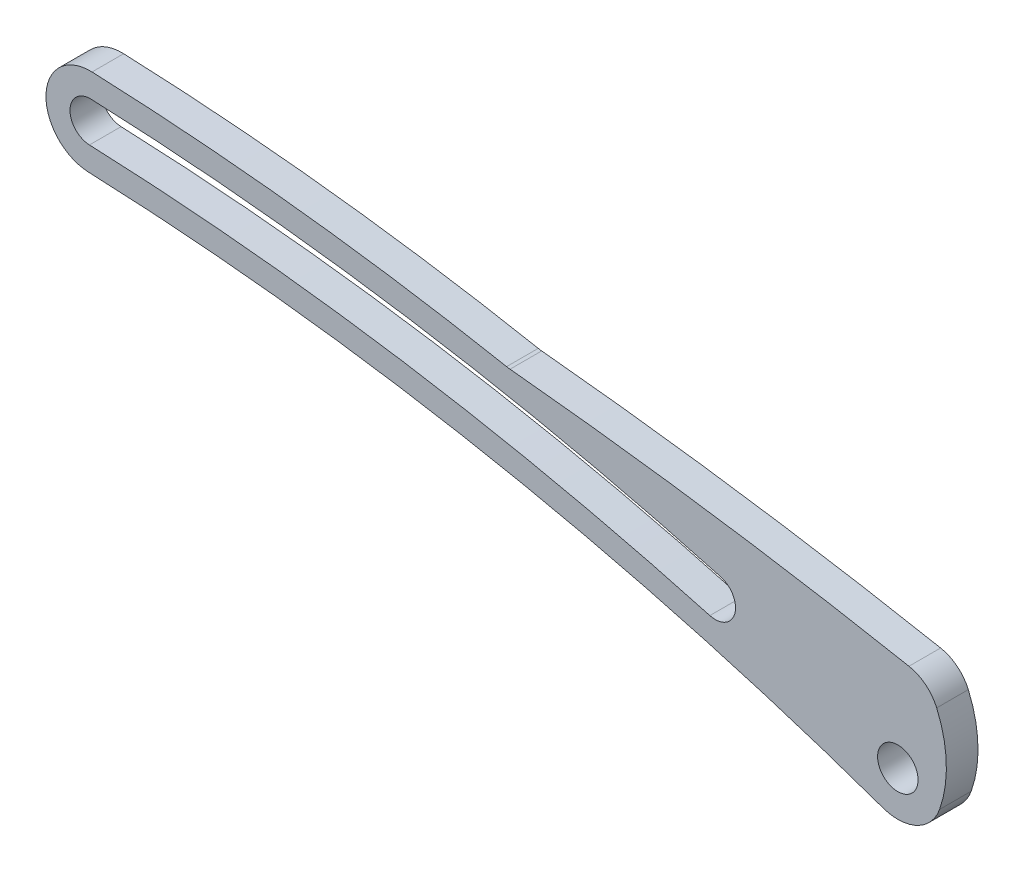
ISO-10303-21;
HEADER;
FILE_DESCRIPTION(('STEP AP214'),'2;1');
FILE_NAME('part.step','',(''),(''),'','','');
FILE_SCHEMA(('AUTOMOTIVE_DESIGN { 1 0 10303 214 1 1 1 1 }'));
ENDSEC;
DATA;
#1=APPLICATION_CONTEXT('core data for automotive mechanical design processes');
#2=APPLICATION_PROTOCOL_DEFINITION('international standard','automotive_design',2000,#1);
#3=PRODUCT_CONTEXT('',#1,'mechanical');
#4=PRODUCT('Part','Part','',(#3));
#5=PRODUCT_RELATED_PRODUCT_CATEGORY('part','',(#4));
#6=PRODUCT_DEFINITION_FORMATION('','',#4);
#7=PRODUCT_DEFINITION_CONTEXT('part definition',#1,'design');
#8=PRODUCT_DEFINITION('design','',#6,#7);
#9=PRODUCT_DEFINITION_SHAPE('','',#8);
#10=(LENGTH_UNIT() NAMED_UNIT(*) SI_UNIT(.MILLI.,.METRE.));
#11=(NAMED_UNIT(*) PLANE_ANGLE_UNIT() SI_UNIT($,.RADIAN.));
#12=(NAMED_UNIT(*) SI_UNIT($,.STERADIAN.) SOLID_ANGLE_UNIT());
#13=UNCERTAINTY_MEASURE_WITH_UNIT(LENGTH_MEASURE(1.E-05),#10,'distance_accuracy_value','');
#14=(GEOMETRIC_REPRESENTATION_CONTEXT(3) GLOBAL_UNCERTAINTY_ASSIGNED_CONTEXT((#13)) GLOBAL_UNIT_ASSIGNED_CONTEXT((#10,
#11,#12)) REPRESENTATION_CONTEXT('',''));
#15=CARTESIAN_POINT('',(0.,0.,0.));
#16=DIRECTION('',(0.,0.,1.));
#17=DIRECTION('',(1.,0.,0.));
#18=AXIS2_PLACEMENT_3D('',#15,#16,#17);
#19=CARTESIAN_POINT('',(-22.5000187521249,-6.99999999999998,2.5));
#20=DIRECTION('',(0.,0.,-1.));
#21=DIRECTION('',(-1.,0.,0.));
#22=AXIS2_PLACEMENT_3D('',#19,#20,#21);
#23=CYLINDRICAL_SURFACE('',#22,3.5);
#24=DIRECTION('',(0.,0.,-1.));
#25=VECTOR('',#24,1.);
#26=CARTESIAN_POINT('',(-19.2019250944073,-8.17157083649374,2.5));
#27=LINE('',#26,#25);
#28=CARTESIAN_POINT('',(-19.2019250944073,-8.17157083649374,2.5));
#29=VERTEX_POINT('',#28);
#30=CARTESIAN_POINT('',(-19.2019250944073,-8.17157083649374,0.));
#31=VERTEX_POINT('',#30);
#32=EDGE_CURVE('E237',#29,#31,#27,.T.);
#33=ORIENTED_EDGE('',*,*,#32,.F.);
#34=CARTESIAN_POINT('',(-22.5000187521249,-6.99999999999998,2.5));
#35=DIRECTION('',(0.,0.,1.));
#36=DIRECTION('',(1.,0.,0.));
#37=AXIS2_PLACEMENT_3D('',#34,#35,#36);
#38=CIRCLE('',#37,3.5);
#39=CARTESIAN_POINT('',(-23.6715895886187,-10.2980936577176,2.5));
#40=VERTEX_POINT('',#39);
#41=EDGE_CURVE('E219',#40,#29,#38,.T.);
#42=ORIENTED_EDGE('',*,*,#41,.F.);
#43=DIRECTION('',(0.,0.,-1.));
#44=VECTOR('',#43,1.);
#45=CARTESIAN_POINT('',(-23.6715895886187,-10.2980936577176,2.5));
#46=LINE('',#45,#44);
#47=CARTESIAN_POINT('',(-23.6715895886187,-10.2980936577176,0.));
#48=VERTEX_POINT('',#47);
#49=EDGE_CURVE('E158',#40,#48,#46,.T.);
#50=ORIENTED_EDGE('',*,*,#49,.T.);
#51=CARTESIAN_POINT('',(-22.5000187521249,-6.99999999999998,0.));
#52=DIRECTION('',(0.,0.,1.));
#53=DIRECTION('',(1.,0.,0.));
#54=AXIS2_PLACEMENT_3D('',#51,#52,#53);
#55=CIRCLE('',#54,3.5);
#56=EDGE_CURVE('E251',#48,#31,#55,.T.);
#57=ORIENTED_EDGE('',*,*,#56,.T.);
#58=EDGE_LOOP('',(#33,#42,#50,#57));
#59=FACE_BOUND('',#58,.T.);
#60=ADVANCED_FACE('F41',(#59),#23,.T.);
#61=CARTESIAN_POINT('',(-94.9700433523818,-211.010650541677,2.5));
#62=DIRECTION('',(0.,0.,-1.));
#63=DIRECTION('',(-1.,0.,0.));
#64=AXIS2_PLACEMENT_3D('',#61,#62,#63);
#65=CYLINDRICAL_SURFACE('',#64,220.);
#66=CARTESIAN_POINT('',(-94.9700433523818,-211.010650541677,2.5));
#67=DIRECTION('',(0.,0.,1.));
#68=DIRECTION('',(1.,0.,0.));
#69=AXIS2_PLACEMENT_3D('',#66,#67,#68);
#70=CIRCLE('',#69,220.);
#71=CARTESIAN_POINT('',(-53.4181436678845,5.02971520650811,2.5));
#72=VERTEX_POINT('',#71);
#73=CARTESIAN_POINT('',(-86.1826443651931,8.81378308443306,2.5));
#74=VERTEX_POINT('',#73);
#75=EDGE_CURVE('E210',#72,#74,#70,.T.);
#76=ORIENTED_EDGE('',*,*,#75,.F.);
#77=DIRECTION('',(0.,0.,-1.));
#78=VECTOR('',#77,1.);
#79=CARTESIAN_POINT('',(-53.4181436678845,5.02971520650811,2.5));
#80=LINE('',#79,#78);
#81=CARTESIAN_POINT('',(-53.4181436678845,5.02971520650811,0.));
#82=VERTEX_POINT('',#81);
#83=EDGE_CURVE('E168',#72,#82,#80,.T.);
#84=ORIENTED_EDGE('',*,*,#83,.T.);
#85=CARTESIAN_POINT('',(-94.9700433523818,-211.010650541677,0.));
#86=DIRECTION('',(0.,0.,1.));
#87=DIRECTION('',(1.,0.,0.));
#88=AXIS2_PLACEMENT_3D('',#85,#86,#87);
#89=CIRCLE('',#88,220.);
#90=CARTESIAN_POINT('',(-86.1826443651931,8.81378308443306,0.));
#91=VERTEX_POINT('',#90);
#92=EDGE_CURVE('E193',#82,#91,#89,.T.);
#93=ORIENTED_EDGE('',*,*,#92,.T.);
#94=DIRECTION('',(0.,0.,-1.));
#95=VECTOR('',#94,1.);
#96=CARTESIAN_POINT('',(-86.1826443651931,8.81378308443306,2.5));
#97=LINE('',#96,#95);
#98=EDGE_CURVE('E173',#74,#91,#97,.T.);
#99=ORIENTED_EDGE('',*,*,#98,.F.);
#100=EDGE_LOOP('',(#76,#84,#93,#99));
#101=FACE_BOUND('',#100,.T.);
#102=ADVANCED_FACE('F214',(#101),#65,.T.);
#103=CARTESIAN_POINT('',(-86.3224438945347,5.31657618583584,2.5));
#104=DIRECTION('',(0.,0.,-1.));
#105=DIRECTION('',(-1.,0.,0.));
#106=AXIS2_PLACEMENT_3D('',#103,#104,#105);
#107=CYLINDRICAL_SURFACE('',#106,3.5);
#108=CARTESIAN_POINT('',(-86.3224438945347,5.31657618583584,0.));
#109=DIRECTION('',(0.,0.,1.));
#110=DIRECTION('',(1.,0.,0.));
#111=AXIS2_PLACEMENT_3D('',#108,#109,#110);
#112=CIRCLE('',#111,3.5);
#113=CARTESIAN_POINT('',(-86.4622434238763,1.81936928723866,0.));
#114=VERTEX_POINT('',#113);
#115=EDGE_CURVE('E257',#91,#114,#112,.T.);
#116=ORIENTED_EDGE('',*,*,#115,.T.);
#117=DIRECTION('',(0.,0.,-1.));
#118=VECTOR('',#117,1.);
#119=CARTESIAN_POINT('',(-86.4622434238763,1.81936928723866,2.5));
#120=LINE('',#119,#118);
#121=CARTESIAN_POINT('',(-86.4622434238763,1.81936928723866,2.5));
#122=VERTEX_POINT('',#121);
#123=EDGE_CURVE('E162',#122,#114,#120,.T.);
#124=ORIENTED_EDGE('',*,*,#123,.F.);
#125=CARTESIAN_POINT('',(-86.3224438945347,5.31657618583584,2.5));
#126=DIRECTION('',(0.,0.,1.));
#127=DIRECTION('',(1.,0.,0.));
#128=AXIS2_PLACEMENT_3D('',#125,#126,#127);
#129=CIRCLE('',#128,3.5);
#130=EDGE_CURVE('E218',#74,#122,#129,.T.);
#131=ORIENTED_EDGE('',*,*,#130,.F.);
#132=ORIENTED_EDGE('',*,*,#98,.T.);
#133=EDGE_LOOP('',(#116,#124,#131,#132));
#134=FACE_BOUND('',#133,.T.);
#135=ADVANCED_FACE('F295',(#134),#107,.T.);
#136=CARTESIAN_POINT('',(-94.9700433523818,-211.010650541677,2.5));
#137=DIRECTION('',(0.,0.,-1.));
#138=DIRECTION('',(-1.,0.,0.));
#139=AXIS2_PLACEMENT_3D('',#136,#137,#138);
#140=CYLINDRICAL_SURFACE('',#139,218.1);
#141=CARTESIAN_POINT('',(-94.9700433523818,-211.010650541677,0.));
#142=DIRECTION('',(0.,0.,1.));
#143=DIRECTION('',(1.,0.,0.));
#144=AXIS2_PLACEMENT_3D('',#141,#142,#143);
#145=CIRCLE('',#144,218.1);
#146=CARTESIAN_POINT('',(-86.2585355382643,6.91529933948025,0.));
#147=VERTEX_POINT('',#146);
#148=CARTESIAN_POINT('',(-36.4982119210194,-0.894837407437954,0.));
#149=VERTEX_POINT('',#148);
#150=EDGE_CURVE('E156',#147,#149,#145,.F.);
#151=ORIENTED_EDGE('',*,*,#150,.T.);
#152=DIRECTION('',(0.,0.,-1.));
#153=VECTOR('',#152,1.);
#154=CARTESIAN_POINT('',(-36.4982119210194,-0.894837407437954,2.5));
#155=LINE('',#154,#153);
#156=CARTESIAN_POINT('',(-36.4982119210194,-0.894837407437954,2.5));
#157=VERTEX_POINT('',#156);
#158=EDGE_CURVE('E135',#157,#149,#155,.T.);
#159=ORIENTED_EDGE('',*,*,#158,.F.);
#160=CARTESIAN_POINT('',(-94.9700433523818,-211.010650541677,2.5));
#161=DIRECTION('',(0.,0.,1.));
#162=DIRECTION('',(1.,0.,0.));
#163=AXIS2_PLACEMENT_3D('',#160,#161,#162);
#164=CIRCLE('',#163,218.1);
#165=CARTESIAN_POINT('',(-86.2585355382643,6.91529933948025,2.5));
#166=VERTEX_POINT('',#165);
#167=EDGE_CURVE('E143',#166,#157,#164,.F.);
#168=ORIENTED_EDGE('',*,*,#167,.F.);
#169=DIRECTION('',(0.,0.,-1.));
#170=VECTOR('',#169,1.);
#171=CARTESIAN_POINT('',(-86.2585355382643,6.91529933948025,2.5));
#172=LINE('',#171,#170);
#173=EDGE_CURVE('E232',#166,#147,#172,.T.);
#174=ORIENTED_EDGE('',*,*,#173,.T.);
#175=EDGE_LOOP('',(#151,#159,#168,#174));
#176=FACE_BOUND('',#175,.T.);
#177=ADVANCED_FACE('F154',(#176),#140,.F.);
#178=CARTESIAN_POINT('',(-36.9271662093742,-2.43626473900507,2.5));
#179=DIRECTION('',(0.,0.,-1.));
#180=DIRECTION('',(-1.,0.,0.));
#181=AXIS2_PLACEMENT_3D('',#178,#179,#180);
#182=CYLINDRICAL_SURFACE('',#181,1.59999999999999);
#183=CARTESIAN_POINT('',(-36.9271662093742,-2.43626473900507,0.));
#184=DIRECTION('',(0.,0.,1.));
#185=DIRECTION('',(1.,0.,0.));
#186=AXIS2_PLACEMENT_3D('',#183,#184,#185);
#187=CIRCLE('',#186,1.59999999999999);
#188=CARTESIAN_POINT('',(-37.356120497729,-3.97769207057212,0.));
#189=VERTEX_POINT('',#188);
#190=EDGE_CURVE('E240',#149,#189,#187,.F.);
#191=ORIENTED_EDGE('',*,*,#190,.T.);
#192=DIRECTION('',(0.,0.,-1.));
#193=VECTOR('',#192,1.);
#194=CARTESIAN_POINT('',(-37.356120497729,-3.97769207057212,2.5));
#195=LINE('',#194,#193);
#196=CARTESIAN_POINT('',(-37.356120497729,-3.97769207057212,2.5));
#197=VERTEX_POINT('',#196);
#198=EDGE_CURVE('E137',#197,#189,#195,.T.);
#199=ORIENTED_EDGE('',*,*,#198,.F.);
#200=CARTESIAN_POINT('',(-36.9271662093742,-2.43626473900507,2.5));
#201=DIRECTION('',(0.,0.,1.));
#202=DIRECTION('',(1.,0.,0.));
#203=AXIS2_PLACEMENT_3D('',#200,#201,#202);
#204=CIRCLE('',#203,1.59999999999999);
#205=EDGE_CURVE('E130',#157,#197,#204,.F.);
#206=ORIENTED_EDGE('',*,*,#205,.F.);
#207=ORIENTED_EDGE('',*,*,#158,.T.);
#208=EDGE_LOOP('',(#191,#199,#206,#207));
#209=FACE_BOUND('',#208,.T.);
#210=ADVANCED_FACE('F133',(#209),#182,.F.);
#211=CARTESIAN_POINT('',(-94.9700433523818,-211.010650541677,2.5));
#212=DIRECTION('',(0.,0.,-1.));
#213=DIRECTION('',(-1.,0.,0.));
#214=AXIS2_PLACEMENT_3D('',#211,#212,#213);
#215=CYLINDRICAL_SURFACE('',#214,214.9);
#216=CARTESIAN_POINT('',(-94.9700433523818,-211.010650541677,0.));
#217=DIRECTION('',(0.,0.,1.));
#218=DIRECTION('',(1.,0.,0.));
#219=AXIS2_PLACEMENT_3D('',#216,#217,#218);
#220=CIRCLE('',#219,214.9);
#221=CARTESIAN_POINT('',(-86.3863522508052,3.71785303219143,0.));
#222=VERTEX_POINT('',#221);
#223=EDGE_CURVE('E243',#222,#189,#220,.F.);
#224=ORIENTED_EDGE('',*,*,#223,.F.);
#225=DIRECTION('',(0.,0.,-1.));
#226=VECTOR('',#225,1.);
#227=CARTESIAN_POINT('',(-86.3863522508052,3.71785303219143,2.5));
#228=LINE('',#227,#226);
#229=CARTESIAN_POINT('',(-86.3863522508052,3.71785303219143,2.5));
#230=VERTEX_POINT('',#229);
#231=EDGE_CURVE('E164',#230,#222,#228,.T.);
#232=ORIENTED_EDGE('',*,*,#231,.F.);
#233=CARTESIAN_POINT('',(-94.9700433523818,-211.010650541677,2.5));
#234=DIRECTION('',(0.,0.,1.));
#235=DIRECTION('',(1.,0.,0.));
#236=AXIS2_PLACEMENT_3D('',#233,#234,#235);
#237=CIRCLE('',#236,214.9);
#238=EDGE_CURVE('E142',#230,#197,#237,.F.);
#239=ORIENTED_EDGE('',*,*,#238,.T.);
#240=ORIENTED_EDGE('',*,*,#198,.T.);
#241=EDGE_LOOP('',(#224,#232,#239,#240));
#242=FACE_BOUND('',#241,.T.);
#243=ADVANCED_FACE('F276',(#242),#215,.T.);
#244=CARTESIAN_POINT('',(-86.3224438945347,5.31657618583584,2.5));
#245=DIRECTION('',(0.,0.,-1.));
#246=DIRECTION('',(-1.,0.,0.));
#247=AXIS2_PLACEMENT_3D('',#244,#245,#246);
#248=CYLINDRICAL_SURFACE('',#247,1.59999999999998);
#249=CARTESIAN_POINT('',(-86.3224438945347,5.31657618583584,0.));
#250=DIRECTION('',(0.,0.,1.));
#251=DIRECTION('',(1.,0.,0.));
#252=AXIS2_PLACEMENT_3D('',#249,#250,#251);
#253=CIRCLE('',#252,1.59999999999998);
#254=EDGE_CURVE('E247',#147,#222,#253,.T.);
#255=ORIENTED_EDGE('',*,*,#254,.F.);
#256=ORIENTED_EDGE('',*,*,#173,.F.);
#257=CARTESIAN_POINT('',(-86.3224438945347,5.31657618583584,2.5));
#258=DIRECTION('',(0.,0.,1.));
#259=DIRECTION('',(1.,0.,0.));
#260=AXIS2_PLACEMENT_3D('',#257,#258,#259);
#261=CIRCLE('',#260,1.59999999999998);
#262=EDGE_CURVE('E149',#166,#230,#261,.T.);
#263=ORIENTED_EDGE('',*,*,#262,.T.);
#264=ORIENTED_EDGE('',*,*,#231,.T.);
#265=EDGE_LOOP('',(#255,#256,#263,#264));
#266=FACE_BOUND('',#265,.T.);
#267=ADVANCED_FACE('F274',(#266),#248,.F.);
#268=CARTESIAN_POINT('',(-22.5000187521249,-6.99999999999998,2.5));
#269=DIRECTION('',(0.,0.,-1.));
#270=DIRECTION('',(-1.,0.,0.));
#271=AXIS2_PLACEMENT_3D('',#268,#269,#270);
#272=CYLINDRICAL_SURFACE('',#271,1.6);
#273=CARTESIAN_POINT('',(-22.5000187521249,-6.99999999999998,2.5));
#274=DIRECTION('',(0.,0.,1.));
#275=DIRECTION('',(1.,0.,0.));
#276=AXIS2_PLACEMENT_3D('',#273,#274,#275);
#277=CIRCLE('',#276,1.6);
#278=CARTESIAN_POINT('',(-20.9000187521249,-6.99999999999998,2.5));
#279=VERTEX_POINT('',#278);
#280=EDGE_CURVE('E152',#279,#279,#277,.T.);
#281=ORIENTED_EDGE('',*,*,#280,.T.);
#282=EDGE_LOOP('',(#281));
#283=FACE_BOUND('',#282,.T.);
#284=CARTESIAN_POINT('',(-22.5000187521249,-6.99999999999998,0.));
#285=DIRECTION('',(0.,0.,1.));
#286=DIRECTION('',(1.,0.,0.));
#287=AXIS2_PLACEMENT_3D('',#284,#285,#286);
#288=CIRCLE('',#287,1.6);
#289=CARTESIAN_POINT('',(-20.9000187521249,-6.99999999999998,0.));
#290=VERTEX_POINT('',#289);
#291=EDGE_CURVE('E233',#290,#290,#288,.T.);
#292=ORIENTED_EDGE('',*,*,#291,.F.);
#293=EDGE_LOOP('',(#292));
#294=FACE_BOUND('',#293,.T.);
#295=ADVANCED_FACE('F302',(#283,#294),#272,.F.);
#296=CARTESIAN_POINT('',(-94.9700433523818,-211.010650541677,2.5));
#297=DIRECTION('',(0.,0.,-1.));
#298=DIRECTION('',(-1.,0.,0.));
#299=AXIS2_PLACEMENT_3D('',#296,#297,#298);
#300=CYLINDRICAL_SURFACE('',#299,213.);
#301=CARTESIAN_POINT('',(-94.9700433523818,-211.010650541677,0.));
#302=DIRECTION('',(0.,0.,1.));
#303=DIRECTION('',(1.,0.,0.));
#304=AXIS2_PLACEMENT_3D('',#301,#302,#303);
#305=CIRCLE('',#304,213.);
#306=EDGE_CURVE('E261',#48,#114,#305,.T.);
#307=ORIENTED_EDGE('',*,*,#306,.F.);
#308=ORIENTED_EDGE('',*,*,#49,.F.);
#309=CARTESIAN_POINT('',(-94.9700433523818,-211.010650541677,2.5));
#310=DIRECTION('',(0.,0.,1.));
#311=DIRECTION('',(1.,0.,0.));
#312=AXIS2_PLACEMENT_3D('',#309,#310,#311);
#313=CIRCLE('',#312,213.);
#314=EDGE_CURVE('E223',#40,#122,#313,.T.);
#315=ORIENTED_EDGE('',*,*,#314,.T.);
#316=ORIENTED_EDGE('',*,*,#123,.T.);
#317=EDGE_LOOP('',(#307,#308,#315,#316));
#318=FACE_BOUND('',#317,.T.);
#319=ADVANCED_FACE('F286',(#318),#300,.F.);
#320=CARTESIAN_POINT('',(0.,0.,2.5));
#321=DIRECTION('',(0.,0.,1.));
#322=DIRECTION('',(1.,0.,0.));
#323=AXIS2_PLACEMENT_3D('',#320,#321,#322);
#324=PLANE('',#323);
#325=CARTESIAN_POINT('',(-28.0125467228815,-5.04180303043184,2.5));
#326=DIRECTION('',(0.,0.,-1.));
#327=DIRECTION('',(-1.,0.,0.));
#328=AXIS2_PLACEMENT_3D('',#325,#326,#327);
#329=CIRCLE('',#328,9.35);
#330=CARTESIAN_POINT('',(-19.4296060192224,-1.33294486686297,2.5));
#331=VERTEX_POINT('',#330);
#332=EDGE_CURVE('E402',#331,#29,#329,.T.);
#333=ORIENTED_EDGE('',*,*,#332,.F.);
#334=CARTESIAN_POINT('',(-22.1834907369741,-2.52295283378351,2.5));
#335=DIRECTION('',(0.,0.,1.));
#336=DIRECTION('',(1.,0.,0.));
#337=AXIS2_PLACEMENT_3D('',#334,#335,#336);
#338=CIRCLE('',#337,3.);
#339=CARTESIAN_POINT('',(-21.618751058341,0.423412570469239,2.5));
#340=VERTEX_POINT('',#339);
#341=EDGE_CURVE('E184',#331,#340,#338,.T.);
#342=ORIENTED_EDGE('',*,*,#341,.T.);
#343=CARTESIAN_POINT('',(-87.5050468988714,-343.319217925683,2.5));
#344=DIRECTION('',(0.,0.,-1.));
#345=DIRECTION('',(-1.,0.,0.));
#346=AXIS2_PLACEMENT_3D('',#343,#344,#345);
#347=CIRCLE('',#346,350.);
#348=CARTESIAN_POINT('',(-53.1460326900803,4.99021080486434,2.5));
#349=VERTEX_POINT('',#348);
#350=EDGE_CURVE('E212',#349,#340,#347,.T.);
#351=ORIENTED_EDGE('',*,*,#350,.F.);
#352=CARTESIAN_POINT('',(-52.851526854005,7.97572019398332,2.5));
#353=DIRECTION('',(0.,0.,1.));
#354=DIRECTION('',(1.,0.,0.));
#355=AXIS2_PLACEMENT_3D('',#352,#353,#354);
#356=CIRCLE('',#355,3.);
#357=EDGE_CURVE('E11',#349,#72,#356,.F.);
#358=ORIENTED_EDGE('',*,*,#357,.T.);
#359=ORIENTED_EDGE('',*,*,#75,.T.);
#360=ORIENTED_EDGE('',*,*,#130,.T.);
#361=ORIENTED_EDGE('',*,*,#314,.F.);
#362=ORIENTED_EDGE('',*,*,#41,.T.);
#363=EDGE_LOOP('',(#333,#342,#351,#358,#359,#360,#361,#362));
#364=FACE_BOUND('',#363,.T.);
#365=ORIENTED_EDGE('',*,*,#280,.F.);
#366=EDGE_LOOP('',(#365));
#367=FACE_BOUND('',#366,.T.);
#368=ORIENTED_EDGE('',*,*,#167,.T.);
#369=ORIENTED_EDGE('',*,*,#205,.T.);
#370=ORIENTED_EDGE('',*,*,#238,.F.);
#371=ORIENTED_EDGE('',*,*,#262,.F.);
#372=EDGE_LOOP('',(#368,#369,#370,#371));
#373=FACE_BOUND('',#372,.T.);
#374=ADVANCED_FACE('F147',(#364,#367,#373),#324,.T.);
#375=CARTESIAN_POINT('',(0.,0.,0.));
#376=DIRECTION('',(0.,0.,1.));
#377=DIRECTION('',(1.,0.,0.));
#378=AXIS2_PLACEMENT_3D('',#375,#376,#377);
#379=PLANE('',#378);
#380=CARTESIAN_POINT('',(-87.5050468988714,-343.319217925683,0.));
#381=DIRECTION('',(0.,0.,-1.));
#382=DIRECTION('',(-1.,0.,0.));
#383=AXIS2_PLACEMENT_3D('',#380,#381,#382);
#384=CIRCLE('',#383,350.);
#385=CARTESIAN_POINT('',(-53.1460326900803,4.99021080486434,0.));
#386=VERTEX_POINT('',#385);
#387=CARTESIAN_POINT('',(-21.618751058341,0.423412570469239,0.));
#388=VERTEX_POINT('',#387);
#389=EDGE_CURVE('E191',#386,#388,#384,.T.);
#390=ORIENTED_EDGE('',*,*,#389,.T.);
#391=CARTESIAN_POINT('',(-22.1834907369741,-2.52295283378351,0.));
#392=DIRECTION('',(0.,0.,1.));
#393=DIRECTION('',(1.,0.,0.));
#394=AXIS2_PLACEMENT_3D('',#391,#392,#393);
#395=CIRCLE('',#394,3.);
#396=CARTESIAN_POINT('',(-19.4296060192224,-1.33294486686297,0.));
#397=VERTEX_POINT('',#396);
#398=EDGE_CURVE('E65',#388,#397,#395,.F.);
#399=ORIENTED_EDGE('',*,*,#398,.T.);
#400=CARTESIAN_POINT('',(-28.0125467228815,-5.04180303043184,0.));
#401=DIRECTION('',(0.,0.,-1.));
#402=DIRECTION('',(-1.,0.,0.));
#403=AXIS2_PLACEMENT_3D('',#400,#401,#402);
#404=CIRCLE('',#403,9.35);
#405=EDGE_CURVE('E203',#397,#31,#404,.T.);
#406=ORIENTED_EDGE('',*,*,#405,.T.);
#407=ORIENTED_EDGE('',*,*,#56,.F.);
#408=ORIENTED_EDGE('',*,*,#306,.T.);
#409=ORIENTED_EDGE('',*,*,#115,.F.);
#410=ORIENTED_EDGE('',*,*,#92,.F.);
#411=CARTESIAN_POINT('',(-52.851526854005,7.97572019398332,0.));
#412=DIRECTION('',(0.,0.,1.));
#413=DIRECTION('',(1.,0.,0.));
#414=AXIS2_PLACEMENT_3D('',#411,#412,#413);
#415=CIRCLE('',#414,3.);
#416=EDGE_CURVE('E50',#82,#386,#415,.T.);
#417=ORIENTED_EDGE('',*,*,#416,.T.);
#418=EDGE_LOOP('',(#390,#399,#406,#407,#408,#409,#410,#417));
#419=FACE_BOUND('',#418,.T.);
#420=ORIENTED_EDGE('',*,*,#291,.T.);
#421=EDGE_LOOP('',(#420));
#422=FACE_BOUND('',#421,.T.);
#423=ORIENTED_EDGE('',*,*,#150,.F.);
#424=ORIENTED_EDGE('',*,*,#254,.T.);
#425=ORIENTED_EDGE('',*,*,#223,.T.);
#426=ORIENTED_EDGE('',*,*,#190,.F.);
#427=EDGE_LOOP('',(#423,#424,#425,#426));
#428=FACE_BOUND('',#427,.T.);
#429=ADVANCED_FACE('F189',(#419,#422,#428),#379,.F.);
#430=CARTESIAN_POINT('',(-28.0125467228815,-5.04180303043184,2.5));
#431=DIRECTION('',(0.,0.,-1.));
#432=DIRECTION('',(-1.,0.,0.));
#433=AXIS2_PLACEMENT_3D('',#430,#431,#432);
#434=CYLINDRICAL_SURFACE('',#433,9.35);
#435=ORIENTED_EDGE('',*,*,#405,.F.);
#436=DIRECTION('',(0.,0.,-1.));
#437=VECTOR('',#436,1.);
#438=CARTESIAN_POINT('',(-19.4296060192224,-1.33294486686297,2.5));
#439=LINE('',#438,#437);
#440=EDGE_CURVE('E57',#397,#331,#439,.F.);
#441=ORIENTED_EDGE('',*,*,#440,.T.);
#442=ORIENTED_EDGE('',*,*,#332,.T.);
#443=ORIENTED_EDGE('',*,*,#32,.T.);
#444=EDGE_LOOP('',(#435,#441,#442,#443));
#445=FACE_BOUND('',#444,.T.);
#446=ADVANCED_FACE('F279',(#445),#434,.T.);
#447=CARTESIAN_POINT('',(-87.5050468988714,-343.319217925683,2.5));
#448=DIRECTION('',(0.,0.,-1.));
#449=DIRECTION('',(-1.,0.,0.));
#450=AXIS2_PLACEMENT_3D('',#447,#448,#449);
#451=CYLINDRICAL_SURFACE('',#450,350.);
#452=ORIENTED_EDGE('',*,*,#389,.F.);
#453=DIRECTION('',(0.,0.,-1.));
#454=VECTOR('',#453,1.);
#455=CARTESIAN_POINT('',(-53.1460326900803,4.99021080486439,2.5));
#456=LINE('',#455,#454);
#457=EDGE_CURVE('E177',#386,#349,#456,.F.);
#458=ORIENTED_EDGE('',*,*,#457,.T.);
#459=ORIENTED_EDGE('',*,*,#350,.T.);
#460=DIRECTION('',(0.,0.,-1.));
#461=VECTOR('',#460,1.);
#462=CARTESIAN_POINT('',(-21.618751058341,0.423412570469239,2.5));
#463=LINE('',#462,#461);
#464=EDGE_CURVE('E172',#340,#388,#463,.T.);
#465=ORIENTED_EDGE('',*,*,#464,.T.);
#466=EDGE_LOOP('',(#452,#458,#459,#465));
#467=FACE_BOUND('',#466,.T.);
#468=ADVANCED_FACE('F198',(#467),#451,.T.);
#469=CARTESIAN_POINT('',(-52.851526854005,7.97572019398332,2.5));
#470=DIRECTION('',(0.,0.,1.));
#471=DIRECTION('',(1.,0.,0.));
#472=AXIS2_PLACEMENT_3D('',#469,#470,#471);
#473=CYLINDRICAL_SURFACE('',#472,3.);
#474=ORIENTED_EDGE('',*,*,#357,.F.);
#475=ORIENTED_EDGE('',*,*,#457,.F.);
#476=ORIENTED_EDGE('',*,*,#416,.F.);
#477=ORIENTED_EDGE('',*,*,#83,.F.);
#478=EDGE_LOOP('',(#474,#475,#476,#477));
#479=FACE_BOUND('',#478,.T.);
#480=ADVANCED_FACE('F206',(#479),#473,.F.);
#481=CARTESIAN_POINT('',(-22.1834907369741,-2.52295283378351,2.5));
#482=DIRECTION('',(0.,0.,-1.));
#483=DIRECTION('',(-1.,0.,0.));
#484=AXIS2_PLACEMENT_3D('',#481,#482,#483);
#485=CYLINDRICAL_SURFACE('',#484,3.);
#486=ORIENTED_EDGE('',*,*,#341,.F.);
#487=ORIENTED_EDGE('',*,*,#440,.F.);
#488=ORIENTED_EDGE('',*,*,#398,.F.);
#489=ORIENTED_EDGE('',*,*,#464,.F.);
#490=EDGE_LOOP('',(#486,#487,#488,#489));
#491=FACE_BOUND('',#490,.T.);
#492=ADVANCED_FACE('F43',(#491),#485,.T.);
#493=CLOSED_SHELL('',(#60,#102,#135,#177,#210,#243,#267,#295,#319,#374,#429,#446,#468,#480,#492));
#494=MANIFOLD_SOLID_BREP('B2',#493);
#495=ADVANCED_BREP_SHAPE_REPRESENTATION('',(#18,#494),#14);
#496=SHAPE_DEFINITION_REPRESENTATION(#9,#495);
ENDSEC;
END-ISO-10303-21;
